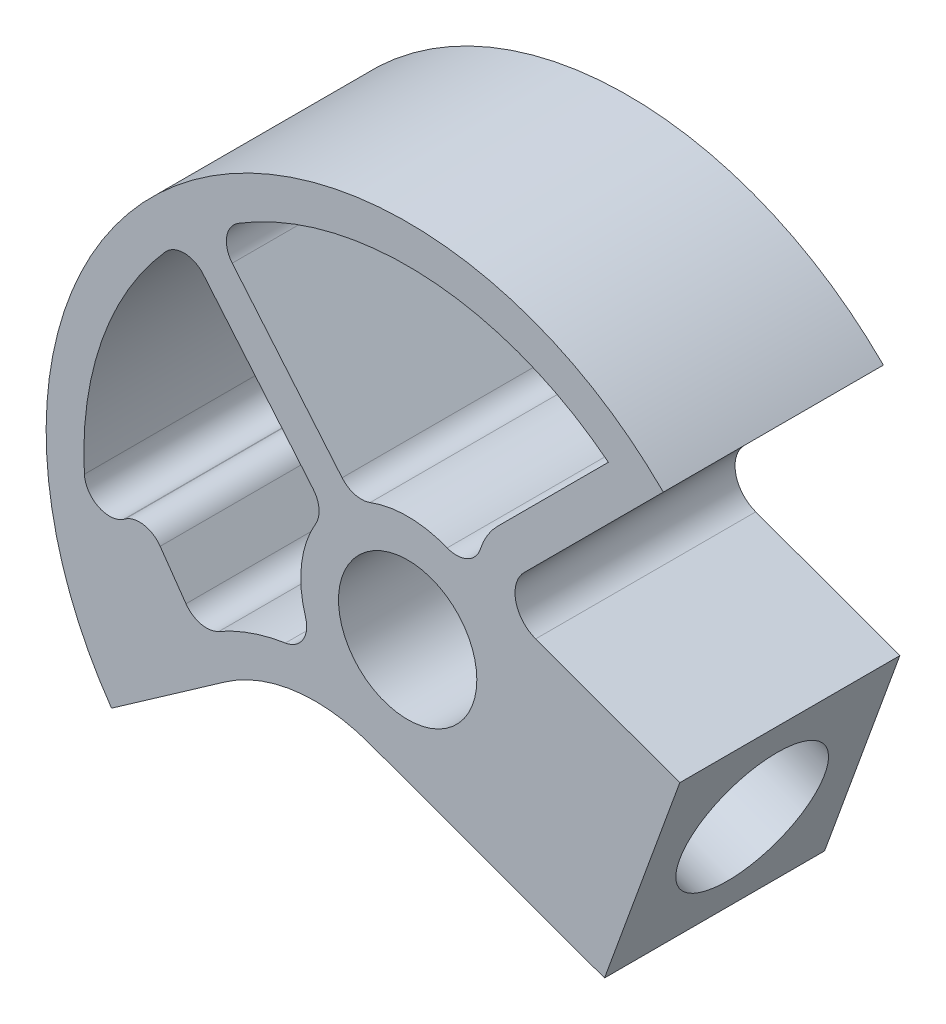
ISO-10303-21;
HEADER;
FILE_DESCRIPTION(('STEP AP214'),'2;1');
FILE_NAME('part.step','',(''),(''),'','','');
FILE_SCHEMA(('AUTOMOTIVE_DESIGN { 1 0 10303 214 1 1 1 1 }'));
ENDSEC;
DATA;
#1=APPLICATION_CONTEXT('core data for automotive mechanical design processes');
#2=APPLICATION_PROTOCOL_DEFINITION('international standard','automotive_design',2000,#1);
#3=PRODUCT_CONTEXT('',#1,'mechanical');
#4=PRODUCT('Part','Part','',(#3));
#5=PRODUCT_RELATED_PRODUCT_CATEGORY('part','',(#4));
#6=PRODUCT_DEFINITION_FORMATION('','',#4);
#7=PRODUCT_DEFINITION_CONTEXT('part definition',#1,'design');
#8=PRODUCT_DEFINITION('design','',#6,#7);
#9=PRODUCT_DEFINITION_SHAPE('','',#8);
#10=(LENGTH_UNIT() NAMED_UNIT(*) SI_UNIT(.MILLI.,.METRE.));
#11=(NAMED_UNIT(*) PLANE_ANGLE_UNIT() SI_UNIT($,.RADIAN.));
#12=(NAMED_UNIT(*) SI_UNIT($,.STERADIAN.) SOLID_ANGLE_UNIT());
#13=UNCERTAINTY_MEASURE_WITH_UNIT(LENGTH_MEASURE(1.E-05),#10,'distance_accuracy_value','');
#14=(GEOMETRIC_REPRESENTATION_CONTEXT(3) GLOBAL_UNCERTAINTY_ASSIGNED_CONTEXT((#13)) GLOBAL_UNIT_ASSIGNED_CONTEXT((#10,
#11,#12)) REPRESENTATION_CONTEXT('',''));
#15=CARTESIAN_POINT('',(0.,0.,0.));
#16=DIRECTION('',(0.,0.,1.));
#17=DIRECTION('',(1.,0.,0.));
#18=AXIS2_PLACEMENT_3D('',#15,#16,#17);
#19=CARTESIAN_POINT('',(0.,0.,35.));
#20=DIRECTION('',(0.,0.,1.));
#21=DIRECTION('',(1.,0.,0.));
#22=AXIS2_PLACEMENT_3D('',#19,#20,#21);
#23=PLANE('',#22);
#24=DIRECTION('',(0.939692620785907,-0.342020143325673,0.));
#25=VECTOR('',#24,1.);
#26=CARTESIAN_POINT('',(5.69118127012725,15.6363920296975,35.));
#27=LINE('',#26,#25);
#28=CARTESIAN_POINT('',(20.3576603883458,10.298230189179,35.));
#29=VERTEX_POINT('',#28);
#30=CARTESIAN_POINT('',(43.2788861015635,1.95558629667055,35.));
#31=VERTEX_POINT('',#30);
#32=EDGE_CURVE('E347',#29,#31,#27,.T.);
#33=ORIENTED_EDGE('',*,*,#32,.F.);
#34=CARTESIAN_POINT('',(22.0677611049741,14.9966932931086,35.));
#35=DIRECTION('',(0.,0.,1.));
#36=DIRECTION('',(1.,0.,0.));
#37=AXIS2_PLACEMENT_3D('',#34,#35,#36);
#38=CIRCLE('',#37,5.);
#39=CARTESIAN_POINT('',(18.5322271990414,18.5322271990413,35.));
#40=VERTEX_POINT('',#39);
#41=EDGE_CURVE('E395',#29,#40,#38,.F.);
#42=ORIENTED_EDGE('',*,*,#41,.T.);
#43=DIRECTION('',(0.707106781186549,0.707106781186546,0.));
#44=VECTOR('',#43,1.);
#45=CARTESIAN_POINT('',(0.,0.,35.));
#46=LINE('',#45,#44);
#47=CARTESIAN_POINT('',(40.6586399182266,40.6586399182264,35.));
#48=VERTEX_POINT('',#47);
#49=EDGE_CURVE('E333',#40,#48,#46,.T.);
#50=ORIENTED_EDGE('',*,*,#49,.T.);
#51=CARTESIAN_POINT('',(0.,0.,35.));
#52=DIRECTION('',(0.,0.,1.));
#53=DIRECTION('',(1.,0.,0.));
#54=AXIS2_PLACEMENT_3D('',#51,#52,#53);
#55=CIRCLE('',#54,57.5);
#56=CARTESIAN_POINT('',(-47.1012425466169,-32.9806450901854,35.));
#57=VERTEX_POINT('',#56);
#58=EDGE_CURVE('E335',#48,#57,#55,.T.);
#59=ORIENTED_EDGE('',*,*,#58,.T.);
#60=DIRECTION('',(-0.819152044288989,-0.57357643635105,0.));
#61=VECTOR('',#60,1.);
#62=CARTESIAN_POINT('',(0.,0.,35.));
#63=LINE('',#62,#61);
#64=CARTESIAN_POINT('',(-29.0206882515002,-20.3205046777346,35.));
#65=VERTEX_POINT('',#64);
#66=EDGE_CURVE('E339',#65,#57,#63,.T.);
#67=ORIENTED_EDGE('',*,*,#66,.F.);
#68=CARTESIAN_POINT('',(-14.6812773427239,-40.7993057849593,35.));
#69=DIRECTION('',(0.,0.,1.));
#70=DIRECTION('',(1.,0.,0.));
#71=AXIS2_PLACEMENT_3D('',#68,#69,#70);
#72=CIRCLE('',#71,25.);
#73=CARTESIAN_POINT('',(-6.13077375958212,-17.3069902653116,35.));
#74=VERTEX_POINT('',#73);
#75=EDGE_CURVE('E386',#65,#74,#72,.F.);
#76=ORIENTED_EDGE('',*,*,#75,.T.);
#77=DIRECTION('',(-0.939692620785907,0.342020143325673,0.));
#78=VECTOR('',#77,1.);
#79=CARTESIAN_POINT('',(-6.2795237462713,-17.2528496978093,35.));
#80=LINE('',#79,#78);
#81=CARTESIAN_POINT('',(31.308181085165,-30.9336554308362,35.));
#82=VERTEX_POINT('',#81);
#83=EDGE_CURVE('E341',#82,#74,#80,.T.);
#84=ORIENTED_EDGE('',*,*,#83,.F.);
#85=DIRECTION('',(-0.342020143325673,-0.939692620785907,0.));
#86=VECTOR('',#85,1.);
#87=CARTESIAN_POINT('',(37.5877048314363,-13.6808057330269,35.));
#88=LINE('',#87,#86);
#89=EDGE_CURVE('E344',#31,#82,#88,.T.);
#90=ORIENTED_EDGE('',*,*,#89,.F.);
#91=EDGE_LOOP('',(#33,#42,#50,#59,#67,#76,#84,#90));
#92=FACE_BOUND('',#91,.T.);
#93=CARTESIAN_POINT('',(0.,0.,35.));
#94=DIRECTION('',(0.,0.,1.));
#95=DIRECTION('',(1.,0.,0.));
#96=AXIS2_PLACEMENT_3D('',#93,#94,#95);
#97=CIRCLE('',#96,11.);
#98=CARTESIAN_POINT('',(11.,0.,35.));
#99=VERTEX_POINT('',#98);
#100=EDGE_CURVE('E349',#99,#99,#97,.T.);
#101=ORIENTED_EDGE('',*,*,#100,.F.);
#102=EDGE_LOOP('',(#101));
#103=FACE_BOUND('',#102,.T.);
#104=DIRECTION('',(-0.573576436351049,0.81915204428899,0.));
#105=VECTOR('',#104,1.);
#106=CARTESIAN_POINT('',(-29.6117658640515,-20.73438167771,35.));
#107=LINE('',#106,#105);
#108=CARTESIAN_POINT('',(-35.2592669215195,-12.6689142994131,35.));
#109=VERTEX_POINT('',#108);
#110=CARTESIAN_POINT('',(-39.3625652820193,-6.80879692479715,35.));
#111=VERTEX_POINT('',#110);
#112=EDGE_CURVE('E312',#109,#111,#107,.T.);
#113=ORIENTED_EDGE('',*,*,#112,.T.);
#114=CARTESIAN_POINT('',(-42.6391734591753,-9.10310267020134,35.));
#115=DIRECTION('',(0.,0.,1.));
#116=DIRECTION('',(1.,0.,0.));
#117=AXIS2_PLACEMENT_3D('',#114,#115,#116);
#118=CIRCLE('',#117,4.);
#119=CARTESIAN_POINT('',(-44.9334792045795,-5.8264944930454,35.));
#120=VERTEX_POINT('',#119);
#121=EDGE_CURVE('E417',#111,#120,#118,.T.);
#122=ORIENTED_EDGE('',*,*,#121,.T.);
#123=DIRECTION('',(-0.81915204428899,-0.57357643635105,0.));
#124=VECTOR('',#123,1.);
#125=CARTESIAN_POINT('',(-12.045105163372,17.2021929300688,35.));
#126=LINE('',#125,#124);
#127=CARTESIAN_POINT('',(-45.1296208678522,-5.96383436422595,35.));
#128=VERTEX_POINT('',#127);
#129=EDGE_CURVE('E315',#120,#128,#126,.T.);
#130=ORIENTED_EDGE('',*,*,#129,.T.);
#131=CARTESIAN_POINT('',(-47.4239266132564,-2.68722618706998,35.));
#132=DIRECTION('',(0.,0.,1.));
#133=DIRECTION('',(1.,0.,0.));
#134=AXIS2_PLACEMENT_3D('',#131,#132,#133);
#135=CIRCLE('',#134,4.);
#136=CARTESIAN_POINT('',(-51.4175204333201,-2.91351891861271,35.));
#137=VERTEX_POINT('',#136);
#138=EDGE_CURVE('E445',#128,#137,#135,.F.);
#139=ORIENTED_EDGE('',*,*,#138,.T.);
#140=CARTESIAN_POINT('',(0.,0.,35.));
#141=DIRECTION('',(0.,0.,1.));
#142=DIRECTION('',(1.,0.,0.));
#143=AXIS2_PLACEMENT_3D('',#140,#141,#142);
#144=CIRCLE('',#143,51.5);
#145=CARTESIAN_POINT('',(-38.5560004035327,34.1421269531174,35.));
#146=VERTEX_POINT('',#145);
#147=EDGE_CURVE('E319',#146,#137,#144,.T.);
#148=ORIENTED_EDGE('',*,*,#147,.F.);
#149=CARTESIAN_POINT('',(-35.5613595954913,31.4903112674384,35.));
#150=DIRECTION('',(0.,0.,1.));
#151=DIRECTION('',(1.,0.,0.));
#152=AXIS2_PLACEMENT_3D('',#149,#150,#151);
#153=CIRCLE('',#152,4.);
#154=CARTESIAN_POINT('',(-32.4971818230154,34.0614617061846,35.));
#155=VERTEX_POINT('',#154);
#156=EDGE_CURVE('E461',#146,#155,#153,.F.);
#157=ORIENTED_EDGE('',*,*,#156,.T.);
#158=DIRECTION('',(-0.64278760968654,0.766044443118977,0.));
#159=VECTOR('',#158,1.);
#160=CARTESIAN_POINT('',(-2.29813332935692,-1.92836282905961,35.));
#161=LINE('',#160,#159);
#162=CARTESIAN_POINT('',(-15.0246787041742,13.238543342692,35.));
#163=VERTEX_POINT('',#162);
#164=EDGE_CURVE('E322',#163,#155,#161,.T.);
#165=ORIENTED_EDGE('',*,*,#164,.F.);
#166=CARTESIAN_POINT('',(-18.0888564766501,10.6673929039459,35.));
#167=DIRECTION('',(0.,0.,1.));
#168=DIRECTION('',(1.,0.,0.));
#169=AXIS2_PLACEMENT_3D('',#166,#167,#168);
#170=CIRCLE('',#169,4.);
#171=CARTESIAN_POINT('',(-14.6433600049072,8.63550854128951,35.));
#172=VERTEX_POINT('',#171);
#173=EDGE_CURVE('E457',#163,#172,#170,.F.);
#174=ORIENTED_EDGE('',*,*,#173,.T.);
#175=CARTESIAN_POINT('',(0.,0.,35.));
#176=DIRECTION('',(0.,0.,1.));
#177=DIRECTION('',(1.,0.,0.));
#178=AXIS2_PLACEMENT_3D('',#175,#176,#177);
#179=CIRCLE('',#178,17.);
#180=CARTESIAN_POINT('',(-16.2384566491258,-5.03115549893478,35.));
#181=VERTEX_POINT('',#180);
#182=EDGE_CURVE('E325',#172,#181,#179,.T.);
#183=ORIENTED_EDGE('',*,*,#182,.T.);
#184=CARTESIAN_POINT('',(-20.0592699783319,-6.21495679280179,35.));
#185=DIRECTION('',(0.,0.,1.));
#186=DIRECTION('',(1.,0.,0.));
#187=AXIS2_PLACEMENT_3D('',#184,#185,#186);
#188=CIRCLE('',#187,4.);
#189=CARTESIAN_POINT('',(-19.4446422485481,-10.1674538204769,35.));
#190=VERTEX_POINT('',#189);
#191=EDGE_CURVE('E453',#181,#190,#188,.F.);
#192=ORIENTED_EDGE('',*,*,#191,.T.);
#193=CARTESIAN_POINT('',(-14.6812773427239,-40.7993057849593,35.));
#194=DIRECTION('',(0.,0.,1.));
#195=DIRECTION('',(1.,0.,0.));
#196=AXIS2_PLACEMENT_3D('',#193,#194,#195);
#197=CIRCLE('',#196,31.);
#198=CARTESIAN_POINT('',(-30.0053580127476,-13.8517168089747,35.));
#199=VERTEX_POINT('',#198);
#200=EDGE_CURVE('E328',#190,#199,#197,.T.);
#201=ORIENTED_EDGE('',*,*,#200,.T.);
#202=CARTESIAN_POINT('',(-31.9826587443635,-10.3746085540089,35.));
#203=DIRECTION('',(0.,0.,1.));
#204=DIRECTION('',(1.,0.,0.));
#205=AXIS2_PLACEMENT_3D('',#202,#203,#204);
#206=CIRCLE('',#205,4.);
#207=EDGE_CURVE('E449',#199,#109,#206,.F.);
#208=ORIENTED_EDGE('',*,*,#207,.T.);
#209=EDGE_LOOP('',(#113,#122,#130,#139,#148,#157,#165,#174,#183,#192,#201,#208));
#210=FACE_BOUND('',#209,.T.);
#211=CARTESIAN_POINT('',(0.,0.,35.));
#212=DIRECTION('',(0.,0.,1.));
#213=DIRECTION('',(1.,0.,0.));
#214=AXIS2_PLACEMENT_3D('',#211,#212,#213);
#215=CIRCLE('',#214,51.5);
#216=CARTESIAN_POINT('',(31.9253700405943,40.4106514148328,35.));
#217=VERTEX_POINT('',#216);
#218=CARTESIAN_POINT('',(-26.9282521195583,43.8989662496226,35.));
#219=VERTEX_POINT('',#218);
#220=EDGE_CURVE('E267',#217,#219,#215,.T.);
#221=ORIENTED_EDGE('',*,*,#220,.F.);
#222=DIRECTION('',(-0.707106781186548,-0.707106781186547,0.));
#223=VECTOR('',#222,1.);
#224=CARTESIAN_POINT('',(-4.24264068711925,4.24264068711925,35.));
#225=LINE('',#224,#223);
#226=CARTESIAN_POINT('',(14.2895865119221,22.7748678861606,35.));
#227=VERTEX_POINT('',#226);
#228=EDGE_CURVE('E278',#217,#227,#225,.T.);
#229=ORIENTED_EDGE('',*,*,#228,.T.);
#230=CARTESIAN_POINT('',(22.0677611049741,14.9966932931086,35.));
#231=DIRECTION('',(0.,0.,1.));
#232=DIRECTION('',(1.,0.,0.));
#233=AXIS2_PLACEMENT_3D('',#230,#231,#232);
#234=CIRCLE('',#233,11.);
#235=CARTESIAN_POINT('',(11.5780192036213,18.3080849707877,35.));
#236=VERTEX_POINT('',#235);
#237=EDGE_CURVE('E472',#227,#236,#234,.T.);
#238=ORIENTED_EDGE('',*,*,#237,.T.);
#239=CARTESIAN_POINT('',(7.76356760312936,19.5122273990347,35.));
#240=DIRECTION('',(0.,0.,1.));
#241=DIRECTION('',(1.,0.,0.));
#242=AXIS2_PLACEMENT_3D('',#239,#240,#241);
#243=CIRCLE('',#242,4.);
#244=CARTESIAN_POINT('',(6.28479282158091,15.7956126563614,35.));
#245=VERTEX_POINT('',#244);
#246=EDGE_CURVE('E86',#236,#245,#243,.F.);
#247=ORIENTED_EDGE('',*,*,#246,.T.);
#248=CARTESIAN_POINT('',(0.,0.,35.));
#249=DIRECTION('',(0.,0.,1.));
#250=DIRECTION('',(1.,0.,0.));
#251=AXIS2_PLACEMENT_3D('',#248,#249,#250);
#252=CIRCLE('',#251,17.);
#253=CARTESIAN_POINT('',(-5.96152298289213,15.9204347844036,35.));
#254=VERTEX_POINT('',#253);
#255=EDGE_CURVE('E289',#245,#254,#252,.T.);
#256=ORIENTED_EDGE('',*,*,#255,.T.);
#257=CARTESIAN_POINT('',(-7.36423427298439,19.6664194395574,35.));
#258=DIRECTION('',(0.,0.,1.));
#259=DIRECTION('',(1.,0.,0.));
#260=AXIS2_PLACEMENT_3D('',#257,#258,#259);
#261=CIRCLE('',#260,4.);
#262=CARTESIAN_POINT('',(-10.4284120454603,17.0952690008113,35.));
#263=VERTEX_POINT('',#262);
#264=EDGE_CURVE('E468',#254,#263,#261,.F.);
#265=ORIENTED_EDGE('',*,*,#264,.T.);
#266=DIRECTION('',(-0.64278760968654,0.766044443118977,0.));
#267=VECTOR('',#266,1.);
#268=CARTESIAN_POINT('',(2.29813332935694,1.92836282905963,35.));
#269=LINE('',#268,#267);
#270=CARTESIAN_POINT('',(-27.9009151643015,37.9181873643038,35.));
#271=VERTEX_POINT('',#270);
#272=EDGE_CURVE('E287',#263,#271,#269,.T.);
#273=ORIENTED_EDGE('',*,*,#272,.T.);
#274=CARTESIAN_POINT('',(-24.8367373918256,40.48933780305,35.));
#275=DIRECTION('',(0.,0.,1.));
#276=DIRECTION('',(1.,0.,0.));
#277=AXIS2_PLACEMENT_3D('',#274,#275,#276);
#278=CIRCLE('',#277,4.);
#279=EDGE_CURVE('E286',#271,#219,#278,.F.);
#280=ORIENTED_EDGE('',*,*,#279,.T.);
#281=EDGE_LOOP('',(#221,#229,#238,#247,#256,#265,#273,#280));
#282=FACE_BOUND('',#281,.T.);
#283=ADVANCED_FACE('F78',(#92,#103,#210,#282),#23,.T.);
#284=CARTESIAN_POINT('',(0.,0.,0.));
#285=DIRECTION('',(0.,0.,1.));
#286=DIRECTION('',(1.,0.,0.));
#287=AXIS2_PLACEMENT_3D('',#284,#285,#286);
#288=PLANE('',#287);
#289=DIRECTION('',(0.81915204428899,0.573576436351049,0.));
#290=VECTOR('',#289,1.);
#291=CARTESIAN_POINT('',(-12.045105163372,17.2021929300688,0.));
#292=LINE('',#291,#290);
#293=CARTESIAN_POINT('',(-45.1296208678522,-5.96383436422594,0.));
#294=VERTEX_POINT('',#293);
#295=CARTESIAN_POINT('',(-44.9334792045795,-5.82649449304539,0.));
#296=VERTEX_POINT('',#295);
#297=EDGE_CURVE('E305',#294,#296,#292,.T.);
#298=ORIENTED_EDGE('',*,*,#297,.T.);
#299=CARTESIAN_POINT('',(-42.6391734591753,-9.10310267020134,0.));
#300=DIRECTION('',(0.,0.,1.));
#301=DIRECTION('',(1.,0.,0.));
#302=AXIS2_PLACEMENT_3D('',#299,#300,#301);
#303=CIRCLE('',#302,4.);
#304=CARTESIAN_POINT('',(-39.3625652820193,-6.80879692479715,0.));
#305=VERTEX_POINT('',#304);
#306=EDGE_CURVE('E419',#296,#305,#303,.F.);
#307=ORIENTED_EDGE('',*,*,#306,.T.);
#308=DIRECTION('',(0.573576436351049,-0.81915204428899,0.));
#309=VECTOR('',#308,1.);
#310=CARTESIAN_POINT('',(-29.6117658640515,-20.73438167771,0.));
#311=LINE('',#310,#309);
#312=CARTESIAN_POINT('',(-35.2592669215195,-12.6689142994131,0.));
#313=VERTEX_POINT('',#312);
#314=EDGE_CURVE('E308',#305,#313,#311,.T.);
#315=ORIENTED_EDGE('',*,*,#314,.T.);
#316=CARTESIAN_POINT('',(-31.9826587443635,-10.3746085540089,0.));
#317=DIRECTION('',(0.,0.,1.));
#318=DIRECTION('',(1.,0.,0.));
#319=AXIS2_PLACEMENT_3D('',#316,#317,#318);
#320=CIRCLE('',#319,4.);
#321=CARTESIAN_POINT('',(-30.0053580127476,-13.8517168089747,0.));
#322=VERTEX_POINT('',#321);
#323=EDGE_CURVE('E451',#313,#322,#320,.T.);
#324=ORIENTED_EDGE('',*,*,#323,.T.);
#325=CARTESIAN_POINT('',(-14.6812773427239,-40.7993057849593,0.));
#326=DIRECTION('',(0.,0.,1.));
#327=DIRECTION('',(1.,0.,0.));
#328=AXIS2_PLACEMENT_3D('',#325,#326,#327);
#329=CIRCLE('',#328,31.);
#330=CARTESIAN_POINT('',(-19.4446422485481,-10.1674538204769,0.));
#331=VERTEX_POINT('',#330);
#332=EDGE_CURVE('E299',#322,#331,#329,.F.);
#333=ORIENTED_EDGE('',*,*,#332,.T.);
#334=CARTESIAN_POINT('',(-20.0592699783319,-6.21495679280179,0.));
#335=DIRECTION('',(0.,0.,1.));
#336=DIRECTION('',(1.,0.,0.));
#337=AXIS2_PLACEMENT_3D('',#334,#335,#336);
#338=CIRCLE('',#337,4.);
#339=CARTESIAN_POINT('',(-16.2384566491258,-5.03115549893478,0.));
#340=VERTEX_POINT('',#339);
#341=EDGE_CURVE('E455',#331,#340,#338,.T.);
#342=ORIENTED_EDGE('',*,*,#341,.T.);
#343=CARTESIAN_POINT('',(0.,0.,0.));
#344=DIRECTION('',(0.,0.,1.));
#345=DIRECTION('',(1.,0.,0.));
#346=AXIS2_PLACEMENT_3D('',#343,#344,#345);
#347=CIRCLE('',#346,17.);
#348=CARTESIAN_POINT('',(-14.6433600049072,8.63550854128951,0.));
#349=VERTEX_POINT('',#348);
#350=EDGE_CURVE('E295',#340,#349,#347,.F.);
#351=ORIENTED_EDGE('',*,*,#350,.T.);
#352=CARTESIAN_POINT('',(-18.0888564766501,10.6673929039459,0.));
#353=DIRECTION('',(0.,0.,1.));
#354=DIRECTION('',(1.,0.,0.));
#355=AXIS2_PLACEMENT_3D('',#352,#353,#354);
#356=CIRCLE('',#355,4.);
#357=CARTESIAN_POINT('',(-15.0246787041742,13.238543342692,0.));
#358=VERTEX_POINT('',#357);
#359=EDGE_CURVE('E459',#349,#358,#356,.T.);
#360=ORIENTED_EDGE('',*,*,#359,.T.);
#361=DIRECTION('',(0.64278760968654,-0.766044443118977,0.));
#362=VECTOR('',#361,1.);
#363=CARTESIAN_POINT('',(-2.29813332935692,-1.92836282905961,0.));
#364=LINE('',#363,#362);
#365=CARTESIAN_POINT('',(-32.4971818230154,34.0614617061846,0.));
#366=VERTEX_POINT('',#365);
#367=EDGE_CURVE('E298',#366,#358,#364,.T.);
#368=ORIENTED_EDGE('',*,*,#367,.F.);
#369=CARTESIAN_POINT('',(-35.5613595954913,31.4903112674384,0.));
#370=DIRECTION('',(0.,0.,1.));
#371=DIRECTION('',(1.,0.,0.));
#372=AXIS2_PLACEMENT_3D('',#369,#370,#371);
#373=CIRCLE('',#372,4.);
#374=CARTESIAN_POINT('',(-38.5560004035327,34.1421269531174,0.));
#375=VERTEX_POINT('',#374);
#376=EDGE_CURVE('E463',#366,#375,#373,.T.);
#377=ORIENTED_EDGE('',*,*,#376,.T.);
#378=CARTESIAN_POINT('',(0.,0.,0.));
#379=DIRECTION('',(0.,0.,1.));
#380=DIRECTION('',(1.,0.,0.));
#381=AXIS2_PLACEMENT_3D('',#378,#379,#380);
#382=CIRCLE('',#381,51.5);
#383=CARTESIAN_POINT('',(-51.4175204333201,-2.91351891861271,0.));
#384=VERTEX_POINT('',#383);
#385=EDGE_CURVE('E302',#384,#375,#382,.F.);
#386=ORIENTED_EDGE('',*,*,#385,.F.);
#387=CARTESIAN_POINT('',(-47.4239266132564,-2.68722618706998,0.));
#388=DIRECTION('',(0.,0.,1.));
#389=DIRECTION('',(1.,0.,0.));
#390=AXIS2_PLACEMENT_3D('',#387,#388,#389);
#391=CIRCLE('',#390,4.);
#392=EDGE_CURVE('E447',#384,#294,#391,.T.);
#393=ORIENTED_EDGE('',*,*,#392,.T.);
#394=EDGE_LOOP('',(#298,#307,#315,#324,#333,#342,#351,#360,#368,#377,#386,#393));
#395=FACE_BOUND('',#394,.T.);
#396=DIRECTION('',(0.707106781186549,0.707106781186546,0.));
#397=VECTOR('',#396,1.);
#398=CARTESIAN_POINT('',(0.,0.,0.));
#399=LINE('',#398,#397);
#400=CARTESIAN_POINT('',(18.5322271990414,18.5322271990413,0.));
#401=VERTEX_POINT('',#400);
#402=CARTESIAN_POINT('',(40.6586399182266,40.6586399182264,0.));
#403=VERTEX_POINT('',#402);
#404=EDGE_CURVE('E311',#401,#403,#399,.T.);
#405=ORIENTED_EDGE('',*,*,#404,.F.);
#406=CARTESIAN_POINT('',(22.0677611049741,14.9966932931086,0.));
#407=DIRECTION('',(0.,0.,1.));
#408=DIRECTION('',(1.,0.,0.));
#409=AXIS2_PLACEMENT_3D('',#406,#407,#408);
#410=CIRCLE('',#409,5.);
#411=CARTESIAN_POINT('',(20.3576603883458,10.298230189179,0.));
#412=VERTEX_POINT('',#411);
#413=EDGE_CURVE('E393',#401,#412,#410,.T.);
#414=ORIENTED_EDGE('',*,*,#413,.T.);
#415=DIRECTION('',(0.939692620785907,-0.342020143325673,0.));
#416=VECTOR('',#415,1.);
#417=CARTESIAN_POINT('',(5.69118127012725,15.6363920296975,0.));
#418=LINE('',#417,#416);
#419=CARTESIAN_POINT('',(43.2788861015635,1.95558629667055,0.));
#420=VERTEX_POINT('',#419);
#421=EDGE_CURVE('E365',#412,#420,#418,.T.);
#422=ORIENTED_EDGE('',*,*,#421,.T.);
#423=DIRECTION('',(-0.342020143325673,-0.939692620785907,0.));
#424=VECTOR('',#423,1.);
#425=CARTESIAN_POINT('',(37.5877048314363,-13.6808057330269,0.));
#426=LINE('',#425,#424);
#427=CARTESIAN_POINT('',(31.308181085165,-30.9336554308362,0.));
#428=VERTEX_POINT('',#427);
#429=EDGE_CURVE('E362',#420,#428,#426,.T.);
#430=ORIENTED_EDGE('',*,*,#429,.T.);
#431=DIRECTION('',(-0.939692620785907,0.342020143325673,0.));
#432=VECTOR('',#431,1.);
#433=CARTESIAN_POINT('',(-6.2795237462713,-17.2528496978093,0.));
#434=LINE('',#433,#432);
#435=CARTESIAN_POINT('',(-6.13077375958212,-17.3069902653116,0.));
#436=VERTEX_POINT('',#435);
#437=EDGE_CURVE('E359',#428,#436,#434,.T.);
#438=ORIENTED_EDGE('',*,*,#437,.T.);
#439=CARTESIAN_POINT('',(-14.6812773427239,-40.7993057849593,0.));
#440=DIRECTION('',(0.,0.,1.));
#441=DIRECTION('',(1.,0.,0.));
#442=AXIS2_PLACEMENT_3D('',#439,#440,#441);
#443=CIRCLE('',#442,25.);
#444=CARTESIAN_POINT('',(-29.0206882515002,-20.3205046777346,0.));
#445=VERTEX_POINT('',#444);
#446=EDGE_CURVE('E384',#436,#445,#443,.T.);
#447=ORIENTED_EDGE('',*,*,#446,.T.);
#448=DIRECTION('',(-0.819152044288989,-0.57357643635105,0.));
#449=VECTOR('',#448,1.);
#450=CARTESIAN_POINT('',(0.,0.,0.));
#451=LINE('',#450,#449);
#452=CARTESIAN_POINT('',(-47.1012425466169,-32.9806450901854,0.));
#453=VERTEX_POINT('',#452);
#454=EDGE_CURVE('E357',#445,#453,#451,.T.);
#455=ORIENTED_EDGE('',*,*,#454,.T.);
#456=CARTESIAN_POINT('',(0.,0.,0.));
#457=DIRECTION('',(0.,0.,1.));
#458=DIRECTION('',(1.,0.,0.));
#459=AXIS2_PLACEMENT_3D('',#456,#457,#458);
#460=CIRCLE('',#459,57.5);
#461=EDGE_CURVE('E354',#403,#453,#460,.T.);
#462=ORIENTED_EDGE('',*,*,#461,.F.);
#463=EDGE_LOOP('',(#405,#414,#422,#430,#438,#447,#455,#462));
#464=FACE_BOUND('',#463,.T.);
#465=CARTESIAN_POINT('',(0.,0.,0.));
#466=DIRECTION('',(0.,0.,1.));
#467=DIRECTION('',(1.,0.,0.));
#468=AXIS2_PLACEMENT_3D('',#465,#466,#467);
#469=CIRCLE('',#468,11.);
#470=CARTESIAN_POINT('',(11.,0.,0.));
#471=VERTEX_POINT('',#470);
#472=EDGE_CURVE('E336',#471,#471,#469,.T.);
#473=ORIENTED_EDGE('',*,*,#472,.T.);
#474=EDGE_LOOP('',(#473));
#475=FACE_BOUND('',#474,.T.);
#476=DIRECTION('',(0.707106781186548,0.707106781186547,0.));
#477=VECTOR('',#476,1.);
#478=CARTESIAN_POINT('',(-4.24264068711925,4.24264068711925,0.));
#479=LINE('',#478,#477);
#480=CARTESIAN_POINT('',(14.2895865119221,22.7748678861606,0.));
#481=VERTEX_POINT('',#480);
#482=CARTESIAN_POINT('',(31.9253700405943,40.4106514148328,0.));
#483=VERTEX_POINT('',#482);
#484=EDGE_CURVE('E274',#481,#483,#479,.T.);
#485=ORIENTED_EDGE('',*,*,#484,.T.);
#486=CARTESIAN_POINT('',(0.,0.,0.));
#487=DIRECTION('',(0.,0.,1.));
#488=DIRECTION('',(1.,0.,0.));
#489=AXIS2_PLACEMENT_3D('',#486,#487,#488);
#490=CIRCLE('',#489,51.5);
#491=CARTESIAN_POINT('',(-26.9282521195583,43.8989662496226,0.));
#492=VERTEX_POINT('',#491);
#493=EDGE_CURVE('E270',#492,#483,#490,.F.);
#494=ORIENTED_EDGE('',*,*,#493,.F.);
#495=CARTESIAN_POINT('',(-24.8367373918256,40.48933780305,0.));
#496=DIRECTION('',(0.,0.,1.));
#497=DIRECTION('',(1.,0.,0.));
#498=AXIS2_PLACEMENT_3D('',#495,#496,#497);
#499=CIRCLE('',#498,4.);
#500=CARTESIAN_POINT('',(-27.9009151643015,37.9181873643038,0.));
#501=VERTEX_POINT('',#500);
#502=EDGE_CURVE('E466',#492,#501,#499,.T.);
#503=ORIENTED_EDGE('',*,*,#502,.T.);
#504=DIRECTION('',(0.64278760968654,-0.766044443118977,0.));
#505=VECTOR('',#504,1.);
#506=CARTESIAN_POINT('',(2.29813332935694,1.92836282905963,0.));
#507=LINE('',#506,#505);
#508=CARTESIAN_POINT('',(-10.4284120454603,17.0952690008113,0.));
#509=VERTEX_POINT('',#508);
#510=EDGE_CURVE('E481',#501,#509,#507,.T.);
#511=ORIENTED_EDGE('',*,*,#510,.T.);
#512=CARTESIAN_POINT('',(-7.36423427298439,19.6664194395574,0.));
#513=DIRECTION('',(0.,0.,1.));
#514=DIRECTION('',(1.,0.,0.));
#515=AXIS2_PLACEMENT_3D('',#512,#513,#514);
#516=CIRCLE('',#515,4.);
#517=CARTESIAN_POINT('',(-5.96152298289213,15.9204347844036,0.));
#518=VERTEX_POINT('',#517);
#519=EDGE_CURVE('E470',#509,#518,#516,.T.);
#520=ORIENTED_EDGE('',*,*,#519,.T.);
#521=CARTESIAN_POINT('',(0.,0.,0.));
#522=DIRECTION('',(0.,0.,1.));
#523=DIRECTION('',(1.,0.,0.));
#524=AXIS2_PLACEMENT_3D('',#521,#522,#523);
#525=CIRCLE('',#524,17.);
#526=CARTESIAN_POINT('',(6.28479282158091,15.7956126563614,0.));
#527=VERTEX_POINT('',#526);
#528=EDGE_CURVE('E479',#518,#527,#525,.F.);
#529=ORIENTED_EDGE('',*,*,#528,.T.);
#530=CARTESIAN_POINT('',(7.76356760312936,19.5122273990347,0.));
#531=DIRECTION('',(0.,0.,1.));
#532=DIRECTION('',(1.,0.,0.));
#533=AXIS2_PLACEMENT_3D('',#530,#531,#532);
#534=CIRCLE('',#533,4.);
#535=CARTESIAN_POINT('',(11.5780192036213,18.3080849707877,0.));
#536=VERTEX_POINT('',#535);
#537=EDGE_CURVE('E12',#527,#536,#534,.T.);
#538=ORIENTED_EDGE('',*,*,#537,.T.);
#539=CARTESIAN_POINT('',(22.0677611049741,14.9966932931086,0.));
#540=DIRECTION('',(0.,0.,1.));
#541=DIRECTION('',(1.,0.,0.));
#542=AXIS2_PLACEMENT_3D('',#539,#540,#541);
#543=CIRCLE('',#542,11.);
#544=EDGE_CURVE('E316',#536,#481,#543,.F.);
#545=ORIENTED_EDGE('',*,*,#544,.T.);
#546=EDGE_LOOP('',(#485,#494,#503,#511,#520,#529,#538,#545));
#547=FACE_BOUND('',#546,.T.);
#548=ADVANCED_FACE('F497',(#395,#464,#475,#547),#288,.F.);
#549=CARTESIAN_POINT('',(0.,0.,35.));
#550=DIRECTION('',(-0.707106781186546,0.707106781186549,0.));
#551=DIRECTION('',(-0.707106781186549,-0.707106781186546,0.));
#552=AXIS2_PLACEMENT_3D('',#549,#550,#551);
#553=PLANE('',#552);
#554=ORIENTED_EDGE('',*,*,#49,.F.);
#555=DIRECTION('',(0.,0.,-1.));
#556=VECTOR('',#555,1.);
#557=CARTESIAN_POINT('',(18.5322271990414,18.5322271990413,35.));
#558=LINE('',#557,#556);
#559=EDGE_CURVE('E388',#40,#401,#558,.T.);
#560=ORIENTED_EDGE('',*,*,#559,.T.);
#561=ORIENTED_EDGE('',*,*,#404,.T.);
#562=DIRECTION('',(0.,0.,-1.));
#563=VECTOR('',#562,1.);
#564=CARTESIAN_POINT('',(40.6586399182266,40.6586399182264,35.));
#565=LINE('',#564,#563);
#566=EDGE_CURVE('E376',#48,#403,#565,.T.);
#567=ORIENTED_EDGE('',*,*,#566,.F.);
#568=EDGE_LOOP('',(#554,#560,#561,#567));
#569=FACE_BOUND('',#568,.T.);
#570=ADVANCED_FACE('F524',(#569),#553,.F.);
#571=CARTESIAN_POINT('',(0.,0.,35.));
#572=DIRECTION('',(0.,0.,-1.));
#573=DIRECTION('',(-1.,0.,0.));
#574=AXIS2_PLACEMENT_3D('',#571,#572,#573);
#575=CYLINDRICAL_SURFACE('',#574,57.5);
#576=ORIENTED_EDGE('',*,*,#461,.T.);
#577=DIRECTION('',(0.,0.,-1.));
#578=VECTOR('',#577,1.);
#579=CARTESIAN_POINT('',(-47.1012425466169,-32.9806450901854,35.));
#580=LINE('',#579,#578);
#581=EDGE_CURVE('E373',#57,#453,#580,.T.);
#582=ORIENTED_EDGE('',*,*,#581,.F.);
#583=ORIENTED_EDGE('',*,*,#58,.F.);
#584=ORIENTED_EDGE('',*,*,#566,.T.);
#585=EDGE_LOOP('',(#576,#582,#583,#584));
#586=FACE_BOUND('',#585,.T.);
#587=ADVANCED_FACE('F553',(#586),#575,.T.);
#588=CARTESIAN_POINT('',(0.,0.,35.));
#589=DIRECTION('',(0.57357643635105,-0.819152044288989,0.));
#590=DIRECTION('',(0.819152044288989,0.57357643635105,0.));
#591=AXIS2_PLACEMENT_3D('',#588,#589,#590);
#592=PLANE('',#591);
#593=ORIENTED_EDGE('',*,*,#454,.F.);
#594=DIRECTION('',(0.,0.,-1.));
#595=VECTOR('',#594,1.);
#596=CARTESIAN_POINT('',(-29.0206882515002,-20.3205046777346,35.));
#597=LINE('',#596,#595);
#598=EDGE_CURVE('E382',#445,#65,#597,.F.);
#599=ORIENTED_EDGE('',*,*,#598,.T.);
#600=ORIENTED_EDGE('',*,*,#66,.T.);
#601=ORIENTED_EDGE('',*,*,#581,.T.);
#602=EDGE_LOOP('',(#593,#599,#600,#601));
#603=FACE_BOUND('',#602,.T.);
#604=ADVANCED_FACE('F549',(#603),#592,.T.);
#605=CARTESIAN_POINT('',(-6.2795237462713,-17.2528496978093,35.));
#606=DIRECTION('',(-0.342020143325673,-0.939692620785907,0.));
#607=DIRECTION('',(0.939692620785907,-0.342020143325673,0.));
#608=AXIS2_PLACEMENT_3D('',#605,#606,#607);
#609=PLANE('',#608);
#610=ORIENTED_EDGE('',*,*,#83,.T.);
#611=DIRECTION('',(0.,0.,-1.));
#612=VECTOR('',#611,1.);
#613=CARTESIAN_POINT('',(-6.13077375958212,-17.3069902653116,0.));
#614=LINE('',#613,#612);
#615=EDGE_CURVE('E379',#74,#436,#614,.T.);
#616=ORIENTED_EDGE('',*,*,#615,.T.);
#617=ORIENTED_EDGE('',*,*,#437,.F.);
#618=DIRECTION('',(0.,0.,-1.));
#619=VECTOR('',#618,1.);
#620=CARTESIAN_POINT('',(31.308181085165,-30.9336554308362,35.));
#621=LINE('',#620,#619);
#622=EDGE_CURVE('E371',#82,#428,#621,.T.);
#623=ORIENTED_EDGE('',*,*,#622,.F.);
#624=EDGE_LOOP('',(#610,#616,#617,#623));
#625=FACE_BOUND('',#624,.T.);
#626=ADVANCED_FACE('F545',(#625),#609,.T.);
#627=CARTESIAN_POINT('',(37.5877048314363,-13.6808057330269,35.));
#628=DIRECTION('',(0.939692620785907,-0.342020143325673,0.));
#629=DIRECTION('',(0.342020143325673,0.939692620785907,0.));
#630=AXIS2_PLACEMENT_3D('',#627,#628,#629);
#631=PLANE('',#630);
#632=CARTESIAN_POINT('',(37.2935335933643,-14.4890345670828,17.5));
#633=DIRECTION('',(0.939692620785907,-0.342020143325673,0.));
#634=DIRECTION('',(0.342020143325673,0.939692620785907,0.));
#635=AXIS2_PLACEMENT_3D('',#632,#633,#634);
#636=CIRCLE('',#635,11.5);
#637=CARTESIAN_POINT('',(41.2267652416095,-3.68256942804488,17.5));
#638=VERTEX_POINT('',#637);
#639=EDGE_CURVE('E487',#638,#638,#636,.T.);
#640=ORIENTED_EDGE('',*,*,#639,.F.);
#641=EDGE_LOOP('',(#640));
#642=FACE_BOUND('',#641,.T.);
#643=ORIENTED_EDGE('',*,*,#429,.F.);
#644=DIRECTION('',(0.,0.,-1.));
#645=VECTOR('',#644,1.);
#646=CARTESIAN_POINT('',(43.2788861015635,1.95558629667055,35.));
#647=LINE('',#646,#645);
#648=EDGE_CURVE('E352',#31,#420,#647,.T.);
#649=ORIENTED_EDGE('',*,*,#648,.F.);
#650=ORIENTED_EDGE('',*,*,#89,.T.);
#651=ORIENTED_EDGE('',*,*,#622,.T.);
#652=EDGE_LOOP('',(#643,#649,#650,#651));
#653=FACE_BOUND('',#652,.T.);
#654=ADVANCED_FACE('F541',(#642,#653),#631,.T.);
#655=CARTESIAN_POINT('',(5.69118127012725,15.6363920296975,35.));
#656=DIRECTION('',(0.342020143325673,0.939692620785907,0.));
#657=DIRECTION('',(-0.939692620785907,0.342020143325673,0.));
#658=AXIS2_PLACEMENT_3D('',#655,#656,#657);
#659=PLANE('',#658);
#660=ORIENTED_EDGE('',*,*,#421,.F.);
#661=DIRECTION('',(0.,0.,-1.));
#662=VECTOR('',#661,1.);
#663=CARTESIAN_POINT('',(20.3576603883458,10.298230189179,35.));
#664=LINE('',#663,#662);
#665=EDGE_CURVE('E391',#412,#29,#664,.F.);
#666=ORIENTED_EDGE('',*,*,#665,.T.);
#667=ORIENTED_EDGE('',*,*,#32,.T.);
#668=ORIENTED_EDGE('',*,*,#648,.T.);
#669=EDGE_LOOP('',(#660,#666,#667,#668));
#670=FACE_BOUND('',#669,.T.);
#671=ADVANCED_FACE('F537',(#670),#659,.T.);
#672=CARTESIAN_POINT('',(0.,0.,35.));
#673=DIRECTION('',(0.,0.,-1.));
#674=DIRECTION('',(-1.,0.,0.));
#675=AXIS2_PLACEMENT_3D('',#672,#673,#674);
#676=CYLINDRICAL_SURFACE('',#675,11.);
#677=ORIENTED_EDGE('',*,*,#100,.T.);
#678=EDGE_LOOP('',(#677));
#679=FACE_BOUND('',#678,.T.);
#680=ORIENTED_EDGE('',*,*,#472,.F.);
#681=EDGE_LOOP('',(#680));
#682=FACE_BOUND('',#681,.T.);
#683=ADVANCED_FACE('F533',(#679,#682),#676,.F.);
#684=CARTESIAN_POINT('',(-14.6812773427239,-40.7993057849593,35.));
#685=DIRECTION('',(0.,0.,1.));
#686=DIRECTION('',(1.,0.,0.));
#687=AXIS2_PLACEMENT_3D('',#684,#685,#686);
#688=CYLINDRICAL_SURFACE('',#687,25.);
#689=ORIENTED_EDGE('',*,*,#75,.F.);
#690=ORIENTED_EDGE('',*,*,#598,.F.);
#691=ORIENTED_EDGE('',*,*,#446,.F.);
#692=ORIENTED_EDGE('',*,*,#615,.F.);
#693=EDGE_LOOP('',(#689,#690,#691,#692));
#694=FACE_BOUND('',#693,.T.);
#695=ADVANCED_FACE('F536',(#694),#688,.F.);
#696=CARTESIAN_POINT('',(22.0677611049741,14.9966932931086,35.));
#697=DIRECTION('',(0.,0.,-1.));
#698=DIRECTION('',(-1.,0.,0.));
#699=AXIS2_PLACEMENT_3D('',#696,#697,#698);
#700=CYLINDRICAL_SURFACE('',#699,5.);
#701=ORIENTED_EDGE('',*,*,#41,.F.);
#702=ORIENTED_EDGE('',*,*,#665,.F.);
#703=ORIENTED_EDGE('',*,*,#413,.F.);
#704=ORIENTED_EDGE('',*,*,#559,.F.);
#705=EDGE_LOOP('',(#701,#702,#703,#704));
#706=FACE_BOUND('',#705,.T.);
#707=ADVANCED_FACE('F563',(#706),#700,.F.);
#708=CARTESIAN_POINT('',(-14.6812773427239,-40.7993057849593,-73.7179679175682));
#709=DIRECTION('',(0.,0.,1.));
#710=DIRECTION('',(1.,0.,0.));
#711=AXIS2_PLACEMENT_3D('',#708,#709,#710);
#712=CYLINDRICAL_SURFACE('',#711,31.);
#713=ORIENTED_EDGE('',*,*,#332,.F.);
#714=DIRECTION('',(0.,0.,1.));
#715=VECTOR('',#714,1.);
#716=CARTESIAN_POINT('',(-30.0053580127476,-13.8517168089747,-73.7179679175682));
#717=LINE('',#716,#715);
#718=EDGE_CURVE('E409',#322,#199,#717,.T.);
#719=ORIENTED_EDGE('',*,*,#718,.T.);
#720=ORIENTED_EDGE('',*,*,#200,.F.);
#721=DIRECTION('',(0.,0.,1.));
#722=VECTOR('',#721,1.);
#723=CARTESIAN_POINT('',(-19.4446422485481,-10.1674538204769,-73.7179679175682));
#724=LINE('',#723,#722);
#725=EDGE_CURVE('E407',#190,#331,#724,.F.);
#726=ORIENTED_EDGE('',*,*,#725,.T.);
#727=EDGE_LOOP('',(#713,#719,#720,#726));
#728=FACE_BOUND('',#727,.T.);
#729=ADVANCED_FACE('F567',(#728),#712,.T.);
#730=CARTESIAN_POINT('',(0.,0.,-73.7179679175682));
#731=DIRECTION('',(0.,0.,1.));
#732=DIRECTION('',(1.,0.,0.));
#733=AXIS2_PLACEMENT_3D('',#730,#731,#732);
#734=CYLINDRICAL_SURFACE('',#733,17.);
#735=ORIENTED_EDGE('',*,*,#350,.F.);
#736=DIRECTION('',(0.,0.,1.));
#737=VECTOR('',#736,1.);
#738=CARTESIAN_POINT('',(-16.2384566491258,-5.03115549893478,-73.7179679175682));
#739=LINE('',#738,#737);
#740=EDGE_CURVE('E423',#340,#181,#739,.T.);
#741=ORIENTED_EDGE('',*,*,#740,.T.);
#742=ORIENTED_EDGE('',*,*,#182,.F.);
#743=DIRECTION('',(0.,0.,1.));
#744=VECTOR('',#743,1.);
#745=CARTESIAN_POINT('',(-14.6433600049072,8.63550854128951,-73.7179679175682));
#746=LINE('',#745,#744);
#747=EDGE_CURVE('E421',#172,#349,#746,.F.);
#748=ORIENTED_EDGE('',*,*,#747,.T.);
#749=EDGE_LOOP('',(#735,#741,#742,#748));
#750=FACE_BOUND('',#749,.T.);
#751=ADVANCED_FACE('F628',(#750),#734,.T.);
#752=CARTESIAN_POINT('',(-2.29813332935692,-1.92836282905961,-73.7179679175682));
#753=DIRECTION('',(0.766044443118977,0.642787609686541,0.));
#754=DIRECTION('',(-0.64278760968654,0.766044443118977,0.));
#755=AXIS2_PLACEMENT_3D('',#752,#753,#754);
#756=PLANE('',#755);
#757=ORIENTED_EDGE('',*,*,#367,.T.);
#758=DIRECTION('',(0.,0.,1.));
#759=VECTOR('',#758,1.);
#760=CARTESIAN_POINT('',(-15.0246787041742,13.238543342692,-73.7179679175682));
#761=LINE('',#760,#759);
#762=EDGE_CURVE('E428',#358,#163,#761,.T.);
#763=ORIENTED_EDGE('',*,*,#762,.T.);
#764=ORIENTED_EDGE('',*,*,#164,.T.);
#765=DIRECTION('',(0.,0.,-1.));
#766=VECTOR('',#765,1.);
#767=CARTESIAN_POINT('',(-32.4971818230154,34.0614617061846,0.));
#768=LINE('',#767,#766);
#769=EDGE_CURVE('E426',#155,#366,#768,.T.);
#770=ORIENTED_EDGE('',*,*,#769,.T.);
#771=EDGE_LOOP('',(#757,#763,#764,#770));
#772=FACE_BOUND('',#771,.T.);
#773=ADVANCED_FACE('F597',(#772),#756,.F.);
#774=CARTESIAN_POINT('',(0.,0.,-73.7179679175682));
#775=DIRECTION('',(0.,0.,1.));
#776=DIRECTION('',(1.,0.,0.));
#777=AXIS2_PLACEMENT_3D('',#774,#775,#776);
#778=CYLINDRICAL_SURFACE('',#777,51.5);
#779=ORIENTED_EDGE('',*,*,#147,.T.);
#780=DIRECTION('',(0.,0.,1.));
#781=VECTOR('',#780,1.);
#782=CARTESIAN_POINT('',(-51.4175204333201,-2.91351891861271,-73.7179679175682));
#783=LINE('',#782,#781);
#784=EDGE_CURVE('E405',#137,#384,#783,.F.);
#785=ORIENTED_EDGE('',*,*,#784,.T.);
#786=ORIENTED_EDGE('',*,*,#385,.T.);
#787=DIRECTION('',(0.,0.,1.));
#788=VECTOR('',#787,1.);
#789=CARTESIAN_POINT('',(-38.5560004035327,34.1421269531174,-73.7179679175682));
#790=LINE('',#789,#788);
#791=EDGE_CURVE('E402',#375,#146,#790,.T.);
#792=ORIENTED_EDGE('',*,*,#791,.T.);
#793=EDGE_LOOP('',(#779,#785,#786,#792));
#794=FACE_BOUND('',#793,.T.);
#795=ADVANCED_FACE('F604',(#794),#778,.F.);
#796=CARTESIAN_POINT('',(-12.045105163372,17.2021929300688,-73.7179679175682));
#797=DIRECTION('',(-0.573576436351049,0.819152044288989,0.));
#798=DIRECTION('',(-0.81915204428899,-0.573576436351049,0.));
#799=AXIS2_PLACEMENT_3D('',#796,#797,#798);
#800=PLANE('',#799);
#801=ORIENTED_EDGE('',*,*,#297,.F.);
#802=DIRECTION('',(0.,0.,1.));
#803=VECTOR('',#802,1.);
#804=CARTESIAN_POINT('',(-45.1296208678522,-5.96383436422594,-73.7179679175682));
#805=LINE('',#804,#803);
#806=EDGE_CURVE('E399',#294,#128,#805,.T.);
#807=ORIENTED_EDGE('',*,*,#806,.T.);
#808=ORIENTED_EDGE('',*,*,#129,.F.);
#809=DIRECTION('',(0.,0.,1.));
#810=VECTOR('',#809,1.);
#811=CARTESIAN_POINT('',(-44.9334792045795,-5.82649449304539,-73.7179679175682));
#812=LINE('',#811,#810);
#813=EDGE_CURVE('E397',#120,#296,#812,.F.);
#814=ORIENTED_EDGE('',*,*,#813,.T.);
#815=EDGE_LOOP('',(#801,#807,#808,#814));
#816=FACE_BOUND('',#815,.T.);
#817=ADVANCED_FACE('F611',(#816),#800,.T.);
#818=CARTESIAN_POINT('',(-29.6117658640515,-20.73438167771,-73.7179679175682));
#819=DIRECTION('',(0.81915204428899,0.573576436351049,0.));
#820=DIRECTION('',(-0.573576436351049,0.81915204428899,0.));
#821=AXIS2_PLACEMENT_3D('',#818,#819,#820);
#822=PLANE('',#821);
#823=ORIENTED_EDGE('',*,*,#112,.F.);
#824=DIRECTION('',(0.,0.,-1.));
#825=VECTOR('',#824,1.);
#826=CARTESIAN_POINT('',(-35.2592669215195,-12.6689142994131,0.));
#827=LINE('',#826,#825);
#828=EDGE_CURVE('E415',#109,#313,#827,.T.);
#829=ORIENTED_EDGE('',*,*,#828,.T.);
#830=ORIENTED_EDGE('',*,*,#314,.F.);
#831=DIRECTION('',(0.,0.,1.));
#832=VECTOR('',#831,1.);
#833=CARTESIAN_POINT('',(-39.3625652820193,-6.80879692479715,-73.7179679175682));
#834=LINE('',#833,#832);
#835=EDGE_CURVE('E412',#305,#111,#834,.T.);
#836=ORIENTED_EDGE('',*,*,#835,.T.);
#837=EDGE_LOOP('',(#823,#829,#830,#836));
#838=FACE_BOUND('',#837,.T.);
#839=ADVANCED_FACE('F530',(#838),#822,.T.);
#840=CARTESIAN_POINT('',(-4.24264068711925,4.24264068711925,-73.7179679175682));
#841=DIRECTION('',(-0.707106781186547,0.707106781186548,0.));
#842=DIRECTION('',(-0.707106781186548,-0.707106781186547,0.));
#843=AXIS2_PLACEMENT_3D('',#840,#841,#842);
#844=PLANE('',#843);
#845=DIRECTION('',(0.,0.,1.));
#846=VECTOR('',#845,1.);
#847=CARTESIAN_POINT('',(14.2895865119221,22.7748678861606,-73.7179679175682));
#848=LINE('',#847,#846);
#849=EDGE_CURVE('E275',#481,#227,#848,.T.);
#850=ORIENTED_EDGE('',*,*,#849,.T.);
#851=ORIENTED_EDGE('',*,*,#228,.F.);
#852=DIRECTION('',(0.,0.,1.));
#853=VECTOR('',#852,1.);
#854=CARTESIAN_POINT('',(31.9253700405943,40.4106514148328,-73.7179679175682));
#855=LINE('',#854,#853);
#856=EDGE_CURVE('E263',#483,#217,#855,.T.);
#857=ORIENTED_EDGE('',*,*,#856,.F.);
#858=ORIENTED_EDGE('',*,*,#484,.F.);
#859=EDGE_LOOP('',(#850,#851,#857,#858));
#860=FACE_BOUND('',#859,.T.);
#861=ADVANCED_FACE('F279',(#860),#844,.T.);
#862=CARTESIAN_POINT('',(0.,0.,-73.7179679175682));
#863=DIRECTION('',(0.,0.,1.));
#864=DIRECTION('',(1.,0.,0.));
#865=AXIS2_PLACEMENT_3D('',#862,#863,#864);
#866=CYLINDRICAL_SURFACE('',#865,51.5);
#867=ORIENTED_EDGE('',*,*,#220,.T.);
#868=DIRECTION('',(0.,0.,1.));
#869=VECTOR('',#868,1.);
#870=CARTESIAN_POINT('',(-26.9282521195583,43.8989662496226,-73.7179679175682));
#871=LINE('',#870,#869);
#872=EDGE_CURVE('E436',#219,#492,#871,.F.);
#873=ORIENTED_EDGE('',*,*,#872,.T.);
#874=ORIENTED_EDGE('',*,*,#493,.T.);
#875=ORIENTED_EDGE('',*,*,#856,.T.);
#876=EDGE_LOOP('',(#867,#873,#874,#875));
#877=FACE_BOUND('',#876,.T.);
#878=ADVANCED_FACE('F265',(#877),#866,.F.);
#879=CARTESIAN_POINT('',(2.29813332935694,1.92836282905963,-73.7179679175682));
#880=DIRECTION('',(0.766044443118977,0.64278760968654,0.));
#881=DIRECTION('',(-0.64278760968654,0.766044443118977,0.));
#882=AXIS2_PLACEMENT_3D('',#879,#880,#881);
#883=PLANE('',#882);
#884=ORIENTED_EDGE('',*,*,#510,.F.);
#885=DIRECTION('',(0.,0.,1.));
#886=VECTOR('',#885,1.);
#887=CARTESIAN_POINT('',(-27.9009151643015,37.9181873643038,-73.7179679175682));
#888=LINE('',#887,#886);
#889=EDGE_CURVE('E433',#501,#271,#888,.T.);
#890=ORIENTED_EDGE('',*,*,#889,.T.);
#891=ORIENTED_EDGE('',*,*,#272,.F.);
#892=DIRECTION('',(0.,0.,-1.));
#893=VECTOR('',#892,1.);
#894=CARTESIAN_POINT('',(-10.4284120454603,17.0952690008113,0.));
#895=LINE('',#894,#893);
#896=EDGE_CURVE('E431',#263,#509,#895,.T.);
#897=ORIENTED_EDGE('',*,*,#896,.T.);
#898=EDGE_LOOP('',(#884,#890,#891,#897));
#899=FACE_BOUND('',#898,.T.);
#900=ADVANCED_FACE('F505',(#899),#883,.T.);
#901=CARTESIAN_POINT('',(0.,0.,-73.7179679175682));
#902=DIRECTION('',(0.,0.,1.));
#903=DIRECTION('',(1.,0.,0.));
#904=AXIS2_PLACEMENT_3D('',#901,#902,#903);
#905=CYLINDRICAL_SURFACE('',#904,17.);
#906=ORIENTED_EDGE('',*,*,#528,.F.);
#907=DIRECTION('',(0.,0.,1.));
#908=VECTOR('',#907,1.);
#909=CARTESIAN_POINT('',(-5.96152298289213,15.9204347844036,-73.7179679175682));
#910=LINE('',#909,#908);
#911=EDGE_CURVE('E439',#518,#254,#910,.T.);
#912=ORIENTED_EDGE('',*,*,#911,.T.);
#913=ORIENTED_EDGE('',*,*,#255,.F.);
#914=DIRECTION('',(0.,0.,1.));
#915=VECTOR('',#914,1.);
#916=CARTESIAN_POINT('',(6.28479282158091,15.7956126563614,-73.7179679175682));
#917=LINE('',#916,#915);
#918=EDGE_CURVE('E99',#245,#527,#917,.F.);
#919=ORIENTED_EDGE('',*,*,#918,.T.);
#920=EDGE_LOOP('',(#906,#912,#913,#919));
#921=FACE_BOUND('',#920,.T.);
#922=ADVANCED_FACE('F475',(#921),#905,.T.);
#923=CARTESIAN_POINT('',(22.0677611049741,14.9966932931086,-73.7179679175682));
#924=DIRECTION('',(0.,0.,1.));
#925=DIRECTION('',(1.,0.,0.));
#926=AXIS2_PLACEMENT_3D('',#923,#924,#925);
#927=CYLINDRICAL_SURFACE('',#926,11.);
#928=ORIENTED_EDGE('',*,*,#544,.F.);
#929=DIRECTION('',(0.,0.,1.));
#930=VECTOR('',#929,1.);
#931=CARTESIAN_POINT('',(11.5780192036213,18.3080849707877,-73.7179679175682));
#932=LINE('',#931,#930);
#933=EDGE_CURVE('E442',#536,#236,#932,.T.);
#934=ORIENTED_EDGE('',*,*,#933,.T.);
#935=ORIENTED_EDGE('',*,*,#237,.F.);
#936=ORIENTED_EDGE('',*,*,#849,.F.);
#937=EDGE_LOOP('',(#928,#934,#935,#936));
#938=FACE_BOUND('',#937,.T.);
#939=ADVANCED_FACE('F478',(#938),#927,.T.);
#940=CARTESIAN_POINT('',(-47.4239266132564,-2.68722618706998,-73.7179679175682));
#941=DIRECTION('',(0.,0.,1.));
#942=DIRECTION('',(1.,0.,0.));
#943=AXIS2_PLACEMENT_3D('',#940,#941,#942);
#944=CYLINDRICAL_SURFACE('',#943,4.);
#945=ORIENTED_EDGE('',*,*,#392,.F.);
#946=ORIENTED_EDGE('',*,*,#784,.F.);
#947=ORIENTED_EDGE('',*,*,#138,.F.);
#948=ORIENTED_EDGE('',*,*,#806,.F.);
#949=EDGE_LOOP('',(#945,#946,#947,#948));
#950=FACE_BOUND('',#949,.T.);
#951=ADVANCED_FACE('F569',(#950),#944,.F.);
#952=CARTESIAN_POINT('',(-31.9826587443635,-10.3746085540089,-73.7179679175682));
#953=DIRECTION('',(0.,0.,1.));
#954=DIRECTION('',(1.,0.,0.));
#955=AXIS2_PLACEMENT_3D('',#952,#953,#954);
#956=CYLINDRICAL_SURFACE('',#955,4.);
#957=ORIENTED_EDGE('',*,*,#323,.F.);
#958=ORIENTED_EDGE('',*,*,#828,.F.);
#959=ORIENTED_EDGE('',*,*,#207,.F.);
#960=ORIENTED_EDGE('',*,*,#718,.F.);
#961=EDGE_LOOP('',(#957,#958,#959,#960));
#962=FACE_BOUND('',#961,.T.);
#963=ADVANCED_FACE('F572',(#962),#956,.F.);
#964=CARTESIAN_POINT('',(-42.6391734591753,-9.10310267020134,-73.7179679175682));
#965=DIRECTION('',(0.,0.,1.));
#966=DIRECTION('',(1.,0.,0.));
#967=AXIS2_PLACEMENT_3D('',#964,#965,#966);
#968=CYLINDRICAL_SURFACE('',#967,4.);
#969=ORIENTED_EDGE('',*,*,#306,.F.);
#970=ORIENTED_EDGE('',*,*,#813,.F.);
#971=ORIENTED_EDGE('',*,*,#121,.F.);
#972=ORIENTED_EDGE('',*,*,#835,.F.);
#973=EDGE_LOOP('',(#969,#970,#971,#972));
#974=FACE_BOUND('',#973,.T.);
#975=ADVANCED_FACE('F576',(#974),#968,.T.);
#976=CARTESIAN_POINT('',(-20.0592699783319,-6.21495679280179,-73.7179679175682));
#977=DIRECTION('',(0.,0.,-1.));
#978=DIRECTION('',(-1.,0.,0.));
#979=AXIS2_PLACEMENT_3D('',#976,#977,#978);
#980=CYLINDRICAL_SURFACE('',#979,4.);
#981=ORIENTED_EDGE('',*,*,#341,.F.);
#982=ORIENTED_EDGE('',*,*,#725,.F.);
#983=ORIENTED_EDGE('',*,*,#191,.F.);
#984=ORIENTED_EDGE('',*,*,#740,.F.);
#985=EDGE_LOOP('',(#981,#982,#983,#984));
#986=FACE_BOUND('',#985,.T.);
#987=ADVANCED_FACE('F580',(#986),#980,.F.);
#988=CARTESIAN_POINT('',(-18.0888564766501,10.6673929039459,-73.7179679175682));
#989=DIRECTION('',(0.,0.,1.));
#990=DIRECTION('',(1.,0.,0.));
#991=AXIS2_PLACEMENT_3D('',#988,#989,#990);
#992=CYLINDRICAL_SURFACE('',#991,4.);
#993=ORIENTED_EDGE('',*,*,#359,.F.);
#994=ORIENTED_EDGE('',*,*,#747,.F.);
#995=ORIENTED_EDGE('',*,*,#173,.F.);
#996=ORIENTED_EDGE('',*,*,#762,.F.);
#997=EDGE_LOOP('',(#993,#994,#995,#996));
#998=FACE_BOUND('',#997,.T.);
#999=ADVANCED_FACE('F515',(#998),#992,.F.);
#1000=CARTESIAN_POINT('',(-35.5613595954913,31.4903112674384,-73.7179679175682));
#1001=DIRECTION('',(0.,0.,1.));
#1002=DIRECTION('',(1.,0.,0.));
#1003=AXIS2_PLACEMENT_3D('',#1000,#1001,#1002);
#1004=CYLINDRICAL_SURFACE('',#1003,4.);
#1005=ORIENTED_EDGE('',*,*,#376,.F.);
#1006=ORIENTED_EDGE('',*,*,#769,.F.);
#1007=ORIENTED_EDGE('',*,*,#156,.F.);
#1008=ORIENTED_EDGE('',*,*,#791,.F.);
#1009=EDGE_LOOP('',(#1005,#1006,#1007,#1008));
#1010=FACE_BOUND('',#1009,.T.);
#1011=ADVANCED_FACE('F509',(#1010),#1004,.F.);
#1012=CARTESIAN_POINT('',(-24.8367373918256,40.48933780305,-73.7179679175682));
#1013=DIRECTION('',(0.,0.,1.));
#1014=DIRECTION('',(1.,0.,0.));
#1015=AXIS2_PLACEMENT_3D('',#1012,#1013,#1014);
#1016=CYLINDRICAL_SURFACE('',#1015,4.);
#1017=ORIENTED_EDGE('',*,*,#502,.F.);
#1018=ORIENTED_EDGE('',*,*,#872,.F.);
#1019=ORIENTED_EDGE('',*,*,#279,.F.);
#1020=ORIENTED_EDGE('',*,*,#889,.F.);
#1021=EDGE_LOOP('',(#1017,#1018,#1019,#1020));
#1022=FACE_BOUND('',#1021,.T.);
#1023=ADVANCED_FACE('F507',(#1022),#1016,.F.);
#1024=CARTESIAN_POINT('',(-7.36423427298439,19.6664194395574,-73.7179679175682));
#1025=DIRECTION('',(0.,0.,1.));
#1026=DIRECTION('',(1.,0.,0.));
#1027=AXIS2_PLACEMENT_3D('',#1024,#1025,#1026);
#1028=CYLINDRICAL_SURFACE('',#1027,4.);
#1029=ORIENTED_EDGE('',*,*,#519,.F.);
#1030=ORIENTED_EDGE('',*,*,#896,.F.);
#1031=ORIENTED_EDGE('',*,*,#264,.F.);
#1032=ORIENTED_EDGE('',*,*,#911,.F.);
#1033=EDGE_LOOP('',(#1029,#1030,#1031,#1032));
#1034=FACE_BOUND('',#1033,.T.);
#1035=ADVANCED_FACE('F503',(#1034),#1028,.F.);
#1036=CARTESIAN_POINT('',(7.76356760312936,19.5122273990347,-73.7179679175682));
#1037=DIRECTION('',(0.,0.,-1.));
#1038=DIRECTION('',(-1.,0.,0.));
#1039=AXIS2_PLACEMENT_3D('',#1036,#1037,#1038);
#1040=CYLINDRICAL_SURFACE('',#1039,4.);
#1041=ORIENTED_EDGE('',*,*,#537,.F.);
#1042=ORIENTED_EDGE('',*,*,#918,.F.);
#1043=ORIENTED_EDGE('',*,*,#246,.F.);
#1044=ORIENTED_EDGE('',*,*,#933,.F.);
#1045=EDGE_LOOP('',(#1041,#1042,#1043,#1044));
#1046=FACE_BOUND('',#1045,.T.);
#1047=ADVANCED_FACE('F80',(#1046),#1040,.F.);
#1048=CARTESIAN_POINT('',(18.4996811776461,-7.64863170056936,17.5));
#1049=DIRECTION('',(0.939692620785907,-0.342020143325673,0.));
#1050=DIRECTION('',(0.342020143325673,0.939692620785907,0.));
#1051=AXIS2_PLACEMENT_3D('',#1048,#1049,#1050);
#1052=CYLINDRICAL_SURFACE('',#1051,11.5);
#1053=CARTESIAN_POINT('',(18.4996811776461,-7.64863170056936,17.5));
#1054=DIRECTION('',(0.939692620785907,-0.342020143325673,0.));
#1055=DIRECTION('',(0.342020143325673,0.939692620785907,0.));
#1056=AXIS2_PLACEMENT_3D('',#1053,#1054,#1055);
#1057=CIRCLE('',#1056,11.5);
#1058=CARTESIAN_POINT('',(22.4329128258913,3.15783343846857,17.5));
#1059=VERTEX_POINT('',#1058);
#1060=EDGE_CURVE('E485',#1059,#1059,#1057,.T.);
#1061=ORIENTED_EDGE('',*,*,#1060,.F.);
#1062=EDGE_LOOP('',(#1061));
#1063=FACE_BOUND('',#1062,.T.);
#1064=ORIENTED_EDGE('',*,*,#639,.T.);
#1065=EDGE_LOOP('',(#1064));
#1066=FACE_BOUND('',#1065,.T.);
#1067=ADVANCED_FACE('F655',(#1063,#1066),#1052,.F.);
#1068=CARTESIAN_POINT('',(18.7938524157182,-6.84040286651345,0.));
#1069=DIRECTION('',(0.939692620785907,-0.342020143325673,0.));
#1070=DIRECTION('',(0.342020143325673,0.939692620785907,0.));
#1071=AXIS2_PLACEMENT_3D('',#1068,#1069,#1070);
#1072=PLANE('',#1071);
#1073=ORIENTED_EDGE('',*,*,#1060,.T.);
#1074=EDGE_LOOP('',(#1073));
#1075=FACE_BOUND('',#1074,.T.);
#1076=ADVANCED_FACE('F733',(#1075),#1072,.T.);
#1077=CLOSED_SHELL('',(#283,#548,#570,#587,#604,#626,#654,#671,#683,#695,#707,#729,#751,#773,
#795,#817,#839,#861,#878,#900,#922,#939,#951,#963,#975,#987,#999,#1011,#1023,#1035,#1047,#1067,#1076));
#1078=MANIFOLD_SOLID_BREP('B2',#1077);
#1079=ADVANCED_BREP_SHAPE_REPRESENTATION('',(#18,#1078),#14);
#1080=SHAPE_DEFINITION_REPRESENTATION(#9,#1079);
ENDSEC;
END-ISO-10303-21;
